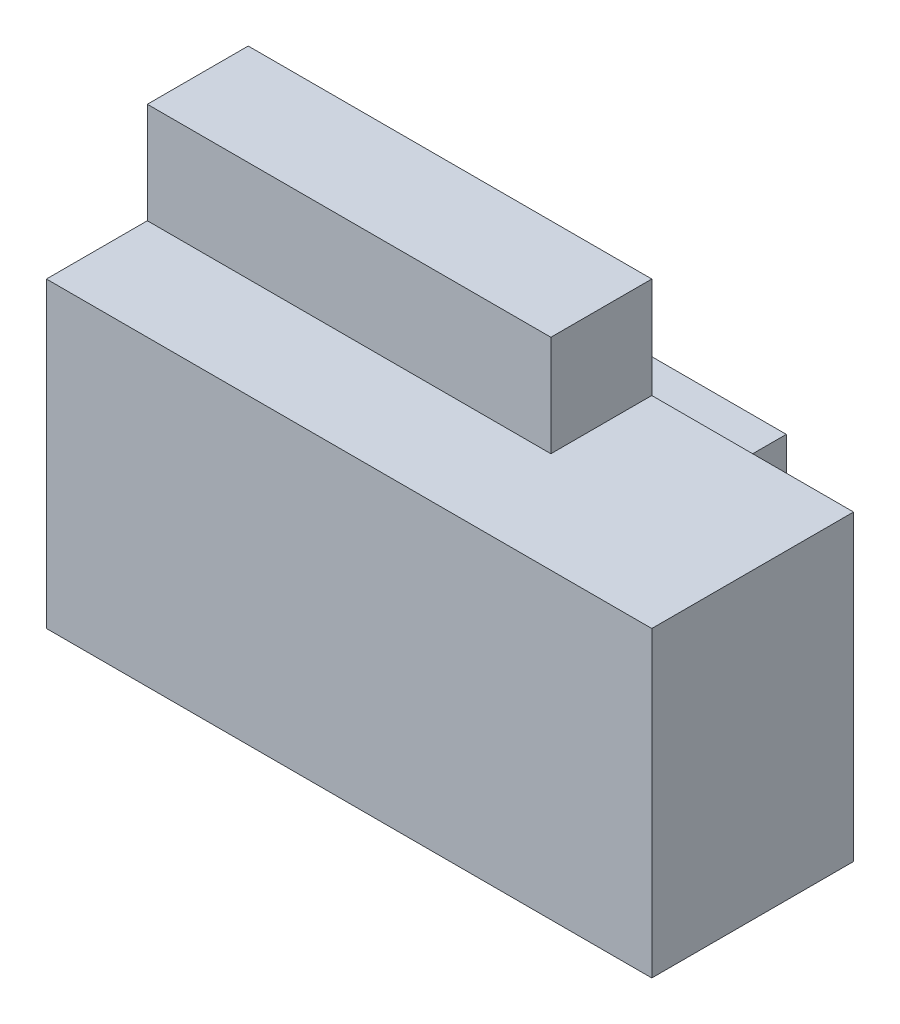
ISO-10303-21;
HEADER;
FILE_DESCRIPTION(('STEP AP214'),'2;1');
FILE_NAME('part.step','',(''),(''),'','','');
FILE_SCHEMA(('AUTOMOTIVE_DESIGN { 1 0 10303 214 1 1 1 1 }'));
ENDSEC;
DATA;
#1=APPLICATION_CONTEXT('core data for automotive mechanical design processes');
#2=APPLICATION_PROTOCOL_DEFINITION('international standard','automotive_design',2000,#1);
#3=PRODUCT_CONTEXT('',#1,'mechanical');
#4=PRODUCT('Part','Part','',(#3));
#5=PRODUCT_RELATED_PRODUCT_CATEGORY('part','',(#4));
#6=PRODUCT_DEFINITION_FORMATION('','',#4);
#7=PRODUCT_DEFINITION_CONTEXT('part definition',#1,'design');
#8=PRODUCT_DEFINITION('design','',#6,#7);
#9=PRODUCT_DEFINITION_SHAPE('','',#8);
#10=(LENGTH_UNIT() NAMED_UNIT(*) SI_UNIT(.MILLI.,.METRE.));
#11=(NAMED_UNIT(*) PLANE_ANGLE_UNIT() SI_UNIT($,.RADIAN.));
#12=(NAMED_UNIT(*) SI_UNIT($,.STERADIAN.) SOLID_ANGLE_UNIT());
#13=UNCERTAINTY_MEASURE_WITH_UNIT(LENGTH_MEASURE(1.E-05),#10,'distance_accuracy_value','');
#14=(GEOMETRIC_REPRESENTATION_CONTEXT(3) GLOBAL_UNCERTAINTY_ASSIGNED_CONTEXT((#13)) GLOBAL_UNIT_ASSIGNED_CONTEXT((#10,
#11,#12)) REPRESENTATION_CONTEXT('',''));
#15=CARTESIAN_POINT('',(0.,0.,0.));
#16=DIRECTION('',(0.,0.,1.));
#17=DIRECTION('',(1.,0.,0.));
#18=AXIS2_PLACEMENT_3D('',#15,#16,#17);
#19=CARTESIAN_POINT('',(0.,36.,-24.));
#20=DIRECTION('',(0.,0.,-1.));
#21=DIRECTION('',(-1.,0.,0.));
#22=AXIS2_PLACEMENT_3D('',#19,#20,#21);
#23=PLANE('',#22);
#24=DIRECTION('',(0.,-1.,0.));
#25=VECTOR('',#24,1.);
#26=CARTESIAN_POINT('',(48.,24.,-24.));
#27=LINE('',#26,#25);
#28=CARTESIAN_POINT('',(48.,24.,-24.));
#29=VERTEX_POINT('',#28);
#30=CARTESIAN_POINT('',(48.,0.,-24.));
#31=VERTEX_POINT('',#30);
#32=EDGE_CURVE('E120',#29,#31,#27,.T.);
#33=ORIENTED_EDGE('',*,*,#32,.F.);
#34=DIRECTION('',(1.,0.,0.));
#35=VECTOR('',#34,1.);
#36=CARTESIAN_POINT('',(0.,24.,-24.));
#37=LINE('',#36,#35);
#38=CARTESIAN_POINT('',(0.,24.,-24.));
#39=VERTEX_POINT('',#38);
#40=EDGE_CURVE('E62',#39,#29,#37,.T.);
#41=ORIENTED_EDGE('',*,*,#40,.F.);
#42=DIRECTION('',(0.,-1.,0.));
#43=VECTOR('',#42,1.);
#44=CARTESIAN_POINT('',(0.,48.,-24.));
#45=LINE('',#44,#43);
#46=CARTESIAN_POINT('',(0.,48.,-24.));
#47=VERTEX_POINT('',#46);
#48=EDGE_CURVE('E182',#47,#39,#45,.T.);
#49=ORIENTED_EDGE('',*,*,#48,.F.);
#50=DIRECTION('',(1.,0.,0.));
#51=VECTOR('',#50,1.);
#52=CARTESIAN_POINT('',(0.,48.,-24.));
#53=LINE('',#52,#51);
#54=CARTESIAN_POINT('',(48.,48.,-24.));
#55=VERTEX_POINT('',#54);
#56=EDGE_CURVE('E164',#47,#55,#53,.T.);
#57=ORIENTED_EDGE('',*,*,#56,.T.);
#58=DIRECTION('',(0.,-1.,0.));
#59=VECTOR('',#58,1.);
#60=CARTESIAN_POINT('',(48.,48.,-24.));
#61=LINE('',#60,#59);
#62=CARTESIAN_POINT('',(48.,36.,-24.));
#63=VERTEX_POINT('',#62);
#64=EDGE_CURVE('E185',#55,#63,#61,.T.);
#65=ORIENTED_EDGE('',*,*,#64,.T.);
#66=DIRECTION('',(1.,0.,0.));
#67=VECTOR('',#66,1.);
#68=CARTESIAN_POINT('',(0.,36.,-24.));
#69=LINE('',#68,#67);
#70=CARTESIAN_POINT('',(72.,36.,-24.));
#71=VERTEX_POINT('',#70);
#72=EDGE_CURVE('E189',#63,#71,#69,.T.);
#73=ORIENTED_EDGE('',*,*,#72,.T.);
#74=DIRECTION('',(0.,-1.,0.));
#75=VECTOR('',#74,1.);
#76=CARTESIAN_POINT('',(72.,36.,-24.));
#77=LINE('',#76,#75);
#78=CARTESIAN_POINT('',(72.,0.,-24.));
#79=VERTEX_POINT('',#78);
#80=EDGE_CURVE('E211',#71,#79,#77,.T.);
#81=ORIENTED_EDGE('',*,*,#80,.T.);
#82=DIRECTION('',(1.,0.,0.));
#83=VECTOR('',#82,1.);
#84=CARTESIAN_POINT('',(0.,0.,-24.));
#85=LINE('',#84,#83);
#86=EDGE_CURVE('E68',#31,#79,#85,.T.);
#87=ORIENTED_EDGE('',*,*,#86,.F.);
#88=EDGE_LOOP('',(#33,#41,#49,#57,#65,#73,#81,#87));
#89=FACE_BOUND('',#88,.T.);
#90=ADVANCED_FACE('F47',(#89),#23,.T.);
#91=CARTESIAN_POINT('',(0.,36.,0.));
#92=DIRECTION('',(-1.,0.,0.));
#93=DIRECTION('',(0.,0.,1.));
#94=AXIS2_PLACEMENT_3D('',#91,#92,#93);
#95=PLANE('',#94);
#96=DIRECTION('',(0.,0.,-1.));
#97=VECTOR('',#96,1.);
#98=CARTESIAN_POINT('',(0.,0.,0.));
#99=LINE('',#98,#97);
#100=CARTESIAN_POINT('',(0.,0.,0.));
#101=VERTEX_POINT('',#100);
#102=CARTESIAN_POINT('',(0.,0.,-40.));
#103=VERTEX_POINT('',#102);
#104=EDGE_CURVE('E214',#101,#103,#99,.T.);
#105=ORIENTED_EDGE('',*,*,#104,.F.);
#106=DIRECTION('',(0.,-1.,0.));
#107=VECTOR('',#106,1.);
#108=CARTESIAN_POINT('',(0.,36.,0.));
#109=LINE('',#108,#107);
#110=CARTESIAN_POINT('',(0.,36.,0.));
#111=VERTEX_POINT('',#110);
#112=EDGE_CURVE('E11',#111,#101,#109,.T.);
#113=ORIENTED_EDGE('',*,*,#112,.F.);
#114=DIRECTION('',(0.,0.,-1.));
#115=VECTOR('',#114,1.);
#116=CARTESIAN_POINT('',(0.,36.,0.));
#117=LINE('',#116,#115);
#118=CARTESIAN_POINT('',(0.,36.,-12.));
#119=VERTEX_POINT('',#118);
#120=EDGE_CURVE('E201',#111,#119,#117,.T.);
#121=ORIENTED_EDGE('',*,*,#120,.T.);
#122=DIRECTION('',(0.,-1.,0.));
#123=VECTOR('',#122,1.);
#124=CARTESIAN_POINT('',(0.,48.,-12.));
#125=LINE('',#124,#123);
#126=CARTESIAN_POINT('',(0.,48.,-12.));
#127=VERTEX_POINT('',#126);
#128=EDGE_CURVE('E179',#127,#119,#125,.T.);
#129=ORIENTED_EDGE('',*,*,#128,.F.);
#130=DIRECTION('',(0.,0.,-1.));
#131=VECTOR('',#130,1.);
#132=CARTESIAN_POINT('',(0.,48.,0.));
#133=LINE('',#132,#131);
#134=EDGE_CURVE('E168',#127,#47,#133,.T.);
#135=ORIENTED_EDGE('',*,*,#134,.T.);
#136=ORIENTED_EDGE('',*,*,#48,.T.);
#137=DIRECTION('',(0.,0.,-1.));
#138=VECTOR('',#137,1.);
#139=CARTESIAN_POINT('',(0.,24.,0.));
#140=LINE('',#139,#138);
#141=CARTESIAN_POINT('',(0.,24.,-40.));
#142=VERTEX_POINT('',#141);
#143=EDGE_CURVE('E140',#39,#142,#140,.T.);
#144=ORIENTED_EDGE('',*,*,#143,.T.);
#145=DIRECTION('',(0.,-1.,0.));
#146=VECTOR('',#145,1.);
#147=CARTESIAN_POINT('',(0.,24.,-40.));
#148=LINE('',#147,#146);
#149=EDGE_CURVE('E153',#142,#103,#148,.T.);
#150=ORIENTED_EDGE('',*,*,#149,.T.);
#151=EDGE_LOOP('',(#105,#113,#121,#129,#135,#136,#144,#150));
#152=FACE_BOUND('',#151,.T.);
#153=ADVANCED_FACE('F245',(#152),#95,.T.);
#154=CARTESIAN_POINT('',(0.,36.,0.));
#155=DIRECTION('',(0.,0.,-1.));
#156=DIRECTION('',(-1.,0.,0.));
#157=AXIS2_PLACEMENT_3D('',#154,#155,#156);
#158=PLANE('',#157);
#159=DIRECTION('',(1.,0.,0.));
#160=VECTOR('',#159,1.);
#161=CARTESIAN_POINT('',(0.,0.,0.));
#162=LINE('',#161,#160);
#163=CARTESIAN_POINT('',(72.,0.,0.));
#164=VERTEX_POINT('',#163);
#165=EDGE_CURVE('E217',#101,#164,#162,.T.);
#166=ORIENTED_EDGE('',*,*,#165,.T.);
#167=DIRECTION('',(0.,-1.,0.));
#168=VECTOR('',#167,1.);
#169=CARTESIAN_POINT('',(72.,36.,0.));
#170=LINE('',#169,#168);
#171=CARTESIAN_POINT('',(72.,36.,0.));
#172=VERTEX_POINT('',#171);
#173=EDGE_CURVE('E55',#172,#164,#170,.T.);
#174=ORIENTED_EDGE('',*,*,#173,.F.);
#175=DIRECTION('',(1.,0.,0.));
#176=VECTOR('',#175,1.);
#177=CARTESIAN_POINT('',(0.,36.,0.));
#178=LINE('',#177,#176);
#179=EDGE_CURVE('E205',#111,#172,#178,.T.);
#180=ORIENTED_EDGE('',*,*,#179,.F.);
#181=ORIENTED_EDGE('',*,*,#112,.T.);
#182=EDGE_LOOP('',(#166,#174,#180,#181));
#183=FACE_BOUND('',#182,.T.);
#184=ADVANCED_FACE('F243',(#183),#158,.F.);
#185=CARTESIAN_POINT('',(72.,36.,0.));
#186=DIRECTION('',(-1.,0.,0.));
#187=DIRECTION('',(0.,0.,1.));
#188=AXIS2_PLACEMENT_3D('',#185,#186,#187);
#189=PLANE('',#188);
#190=DIRECTION('',(0.,0.,-1.));
#191=VECTOR('',#190,1.);
#192=CARTESIAN_POINT('',(72.,0.,0.));
#193=LINE('',#192,#191);
#194=EDGE_CURVE('E194',#164,#79,#193,.T.);
#195=ORIENTED_EDGE('',*,*,#194,.T.);
#196=ORIENTED_EDGE('',*,*,#80,.F.);
#197=DIRECTION('',(0.,0.,-1.));
#198=VECTOR('',#197,1.);
#199=CARTESIAN_POINT('',(72.,36.,0.));
#200=LINE('',#199,#198);
#201=EDGE_CURVE('E208',#172,#71,#200,.T.);
#202=ORIENTED_EDGE('',*,*,#201,.F.);
#203=ORIENTED_EDGE('',*,*,#173,.T.);
#204=EDGE_LOOP('',(#195,#196,#202,#203));
#205=FACE_BOUND('',#204,.T.);
#206=ADVANCED_FACE('F230',(#205),#189,.F.);
#207=CARTESIAN_POINT('',(0.,36.,0.));
#208=DIRECTION('',(0.,1.,0.));
#209=DIRECTION('',(0.,0.,1.));
#210=AXIS2_PLACEMENT_3D('',#207,#208,#209);
#211=PLANE('',#210);
#212=ORIENTED_EDGE('',*,*,#72,.F.);
#213=DIRECTION('',(0.,0.,1.));
#214=VECTOR('',#213,1.);
#215=CARTESIAN_POINT('',(48.,36.,0.));
#216=LINE('',#215,#214);
#217=CARTESIAN_POINT('',(48.,36.,-12.));
#218=VERTEX_POINT('',#217);
#219=EDGE_CURVE('E193',#63,#218,#216,.T.);
#220=ORIENTED_EDGE('',*,*,#219,.T.);
#221=DIRECTION('',(1.,0.,0.));
#222=VECTOR('',#221,1.);
#223=CARTESIAN_POINT('',(0.,36.,-12.));
#224=LINE('',#223,#222);
#225=EDGE_CURVE('E198',#119,#218,#224,.T.);
#226=ORIENTED_EDGE('',*,*,#225,.F.);
#227=ORIENTED_EDGE('',*,*,#120,.F.);
#228=ORIENTED_EDGE('',*,*,#179,.T.);
#229=ORIENTED_EDGE('',*,*,#201,.T.);
#230=EDGE_LOOP('',(#212,#220,#226,#227,#228,#229));
#231=FACE_BOUND('',#230,.T.);
#232=ADVANCED_FACE('F240',(#231),#211,.T.);
#233=CARTESIAN_POINT('',(0.,0.,0.));
#234=DIRECTION('',(0.,1.,0.));
#235=DIRECTION('',(0.,0.,1.));
#236=AXIS2_PLACEMENT_3D('',#233,#234,#235);
#237=PLANE('',#236);
#238=ORIENTED_EDGE('',*,*,#104,.T.);
#239=DIRECTION('',(1.,0.,0.));
#240=VECTOR('',#239,1.);
#241=CARTESIAN_POINT('',(0.,0.,-40.));
#242=LINE('',#241,#240);
#243=CARTESIAN_POINT('',(48.,0.,-40.));
#244=VERTEX_POINT('',#243);
#245=EDGE_CURVE('E142',#103,#244,#242,.T.);
#246=ORIENTED_EDGE('',*,*,#245,.T.);
#247=DIRECTION('',(0.,0.,-1.));
#248=VECTOR('',#247,1.);
#249=CARTESIAN_POINT('',(48.,0.,0.));
#250=LINE('',#249,#248);
#251=EDGE_CURVE('E146',#31,#244,#250,.T.);
#252=ORIENTED_EDGE('',*,*,#251,.F.);
#253=ORIENTED_EDGE('',*,*,#86,.T.);
#254=ORIENTED_EDGE('',*,*,#194,.F.);
#255=ORIENTED_EDGE('',*,*,#165,.F.);
#256=EDGE_LOOP('',(#238,#246,#252,#253,#254,#255));
#257=FACE_BOUND('',#256,.T.);
#258=ADVANCED_FACE('F236',(#257),#237,.F.);
#259=CARTESIAN_POINT('',(48.,48.,0.));
#260=DIRECTION('',(1.,0.,0.));
#261=DIRECTION('',(0.,0.,-1.));
#262=AXIS2_PLACEMENT_3D('',#259,#260,#261);
#263=PLANE('',#262);
#264=DIRECTION('',(0.,-1.,0.));
#265=VECTOR('',#264,1.);
#266=CARTESIAN_POINT('',(48.,48.,-12.));
#267=LINE('',#266,#265);
#268=CARTESIAN_POINT('',(48.,48.,-12.));
#269=VERTEX_POINT('',#268);
#270=EDGE_CURVE('E175',#269,#218,#267,.T.);
#271=ORIENTED_EDGE('',*,*,#270,.T.);
#272=ORIENTED_EDGE('',*,*,#219,.F.);
#273=ORIENTED_EDGE('',*,*,#64,.F.);
#274=DIRECTION('',(0.,0.,1.));
#275=VECTOR('',#274,1.);
#276=CARTESIAN_POINT('',(48.,48.,0.));
#277=LINE('',#276,#275);
#278=EDGE_CURVE('E125',#55,#269,#277,.T.);
#279=ORIENTED_EDGE('',*,*,#278,.T.);
#280=EDGE_LOOP('',(#271,#272,#273,#279));
#281=FACE_BOUND('',#280,.T.);
#282=ADVANCED_FACE('F257',(#281),#263,.T.);
#283=CARTESIAN_POINT('',(0.,48.,-12.));
#284=DIRECTION('',(0.,0.,-1.));
#285=DIRECTION('',(-1.,0.,0.));
#286=AXIS2_PLACEMENT_3D('',#283,#284,#285);
#287=PLANE('',#286);
#288=ORIENTED_EDGE('',*,*,#225,.T.);
#289=ORIENTED_EDGE('',*,*,#270,.F.);
#290=DIRECTION('',(1.,0.,0.));
#291=VECTOR('',#290,1.);
#292=CARTESIAN_POINT('',(0.,48.,-12.));
#293=LINE('',#292,#291);
#294=EDGE_CURVE('E172',#127,#269,#293,.T.);
#295=ORIENTED_EDGE('',*,*,#294,.F.);
#296=ORIENTED_EDGE('',*,*,#128,.T.);
#297=EDGE_LOOP('',(#288,#289,#295,#296));
#298=FACE_BOUND('',#297,.T.);
#299=ADVANCED_FACE('F259',(#298),#287,.F.);
#300=CARTESIAN_POINT('',(0.,48.,0.));
#301=DIRECTION('',(0.,1.,0.));
#302=DIRECTION('',(0.,0.,1.));
#303=AXIS2_PLACEMENT_3D('',#300,#301,#302);
#304=PLANE('',#303);
#305=ORIENTED_EDGE('',*,*,#278,.F.);
#306=ORIENTED_EDGE('',*,*,#56,.F.);
#307=ORIENTED_EDGE('',*,*,#134,.F.);
#308=ORIENTED_EDGE('',*,*,#294,.T.);
#309=EDGE_LOOP('',(#305,#306,#307,#308));
#310=FACE_BOUND('',#309,.T.);
#311=ADVANCED_FACE('F253',(#310),#304,.T.);
#312=CARTESIAN_POINT('',(48.,24.,0.));
#313=DIRECTION('',(-1.,0.,0.));
#314=DIRECTION('',(0.,0.,1.));
#315=AXIS2_PLACEMENT_3D('',#312,#313,#314);
#316=PLANE('',#315);
#317=ORIENTED_EDGE('',*,*,#251,.T.);
#318=DIRECTION('',(0.,-1.,0.));
#319=VECTOR('',#318,1.);
#320=CARTESIAN_POINT('',(48.,24.,-40.));
#321=LINE('',#320,#319);
#322=CARTESIAN_POINT('',(48.,24.,-40.));
#323=VERTEX_POINT('',#322);
#324=EDGE_CURVE('E126',#323,#244,#321,.T.);
#325=ORIENTED_EDGE('',*,*,#324,.F.);
#326=DIRECTION('',(0.,0.,-1.));
#327=VECTOR('',#326,1.);
#328=CARTESIAN_POINT('',(48.,24.,0.));
#329=LINE('',#328,#327);
#330=EDGE_CURVE('E129',#29,#323,#329,.T.);
#331=ORIENTED_EDGE('',*,*,#330,.F.);
#332=ORIENTED_EDGE('',*,*,#32,.T.);
#333=EDGE_LOOP('',(#317,#325,#331,#332));
#334=FACE_BOUND('',#333,.T.);
#335=ADVANCED_FACE('F130',(#334),#316,.F.);
#336=CARTESIAN_POINT('',(0.,24.,-40.));
#337=DIRECTION('',(0.,0.,-1.));
#338=DIRECTION('',(-1.,0.,0.));
#339=AXIS2_PLACEMENT_3D('',#336,#337,#338);
#340=PLANE('',#339);
#341=ORIENTED_EDGE('',*,*,#245,.F.);
#342=ORIENTED_EDGE('',*,*,#149,.F.);
#343=DIRECTION('',(1.,0.,0.));
#344=VECTOR('',#343,1.);
#345=CARTESIAN_POINT('',(0.,24.,-40.));
#346=LINE('',#345,#344);
#347=EDGE_CURVE('E135',#142,#323,#346,.T.);
#348=ORIENTED_EDGE('',*,*,#347,.T.);
#349=ORIENTED_EDGE('',*,*,#324,.T.);
#350=EDGE_LOOP('',(#341,#342,#348,#349));
#351=FACE_BOUND('',#350,.T.);
#352=ADVANCED_FACE('F248',(#351),#340,.T.);
#353=CARTESIAN_POINT('',(0.,24.,0.));
#354=DIRECTION('',(0.,1.,0.));
#355=DIRECTION('',(0.,0.,1.));
#356=AXIS2_PLACEMENT_3D('',#353,#354,#355);
#357=PLANE('',#356);
#358=ORIENTED_EDGE('',*,*,#40,.T.);
#359=ORIENTED_EDGE('',*,*,#330,.T.);
#360=ORIENTED_EDGE('',*,*,#347,.F.);
#361=ORIENTED_EDGE('',*,*,#143,.F.);
#362=EDGE_LOOP('',(#358,#359,#360,#361));
#363=FACE_BOUND('',#362,.T.);
#364=ADVANCED_FACE('F138',(#363),#357,.T.);
#365=CLOSED_SHELL('',(#90,#153,#184,#206,#232,#258,#282,#299,#311,#335,#352,#364));
#366=MANIFOLD_SOLID_BREP('B2',#365);
#367=ADVANCED_BREP_SHAPE_REPRESENTATION('',(#18,#366),#14);
#368=SHAPE_DEFINITION_REPRESENTATION(#9,#367);
ENDSEC;
END-ISO-10303-21;
